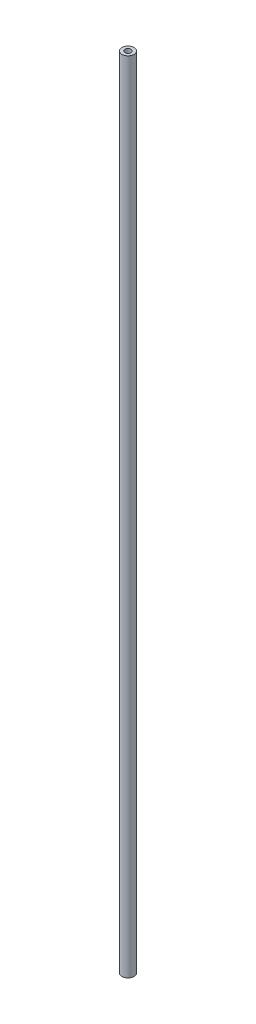
ISO-10303-21;
HEADER;
FILE_DESCRIPTION(('STEP AP214'),'2;1');
FILE_NAME('part.step','',(''),(''),'','','');
FILE_SCHEMA(('AUTOMOTIVE_DESIGN { 1 0 10303 214 1 1 1 1 }'));
ENDSEC;
DATA;
#1=APPLICATION_CONTEXT('core data for automotive mechanical design processes');
#2=APPLICATION_PROTOCOL_DEFINITION('international standard','automotive_design',2000,#1);
#3=PRODUCT_CONTEXT('',#1,'mechanical');
#4=PRODUCT('Part','Part','',(#3));
#5=PRODUCT_RELATED_PRODUCT_CATEGORY('part','',(#4));
#6=PRODUCT_DEFINITION_FORMATION('','',#4);
#7=PRODUCT_DEFINITION_CONTEXT('part definition',#1,'design');
#8=PRODUCT_DEFINITION('design','',#6,#7);
#9=PRODUCT_DEFINITION_SHAPE('','',#8);
#10=(LENGTH_UNIT() NAMED_UNIT(*) SI_UNIT(.MILLI.,.METRE.));
#11=(NAMED_UNIT(*) PLANE_ANGLE_UNIT() SI_UNIT($,.RADIAN.));
#12=(NAMED_UNIT(*) SI_UNIT($,.STERADIAN.) SOLID_ANGLE_UNIT());
#13=UNCERTAINTY_MEASURE_WITH_UNIT(LENGTH_MEASURE(1.E-05),#10,'distance_accuracy_value','');
#14=(GEOMETRIC_REPRESENTATION_CONTEXT(3) GLOBAL_UNCERTAINTY_ASSIGNED_CONTEXT((#13)) GLOBAL_UNIT_ASSIGNED_CONTEXT((#10,
#11,#12)) REPRESENTATION_CONTEXT('',''));
#15=CARTESIAN_POINT('',(0.,0.,0.));
#16=DIRECTION('',(0.,0.,1.));
#17=DIRECTION('',(1.,0.,0.));
#18=AXIS2_PLACEMENT_3D('',#15,#16,#17);
#19=CARTESIAN_POINT('',(0.,841.603219465581,0.));
#20=DIRECTION('',(0.,1.,0.));
#21=DIRECTION('',(0.,0.,1.));
#22=AXIS2_PLACEMENT_3D('',#19,#20,#21);
#23=PLANE('',#22);
#24=CARTESIAN_POINT('',(0.,841.603219465581,0.));
#25=DIRECTION('',(0.,1.,0.));
#26=DIRECTION('',(0.,0.,1.));
#27=AXIS2_PLACEMENT_3D('',#24,#25,#26);
#28=CIRCLE('',#27,6.35);
#29=CARTESIAN_POINT('',(0.,841.603219465581,6.35));
#30=VERTEX_POINT('',#29);
#31=EDGE_CURVE('E10',#30,#30,#28,.T.);
#32=ORIENTED_EDGE('',*,*,#31,.T.);
#33=EDGE_LOOP('',(#32));
#34=FACE_BOUND('',#33,.T.);
#35=CARTESIAN_POINT('',(0.,841.603219465581,0.));
#36=DIRECTION('',(0.,1.,0.));
#37=DIRECTION('',(0.,0.,1.));
#38=AXIS2_PLACEMENT_3D('',#35,#36,#37);
#39=CIRCLE('',#38,3.175);
#40=CARTESIAN_POINT('',(0.,841.603219465581,3.175));
#41=VERTEX_POINT('',#40);
#42=EDGE_CURVE('E59',#41,#41,#39,.T.);
#43=ORIENTED_EDGE('',*,*,#42,.F.);
#44=EDGE_LOOP('',(#43));
#45=FACE_BOUND('',#44,.T.);
#46=ADVANCED_FACE('F44',(#34,#45),#23,.T.);
#47=CARTESIAN_POINT('',(0.,0.,0.));
#48=DIRECTION('',(0.,1.,0.));
#49=DIRECTION('',(0.,0.,1.));
#50=AXIS2_PLACEMENT_3D('',#47,#48,#49);
#51=PLANE('',#50);
#52=CARTESIAN_POINT('',(0.,0.,0.));
#53=DIRECTION('',(0.,1.,0.));
#54=DIRECTION('',(0.,0.,1.));
#55=AXIS2_PLACEMENT_3D('',#52,#53,#54);
#56=CIRCLE('',#55,6.35);
#57=CARTESIAN_POINT('',(0.,0.,6.35));
#58=VERTEX_POINT('',#57);
#59=EDGE_CURVE('E47',#58,#58,#56,.T.);
#60=ORIENTED_EDGE('',*,*,#59,.F.);
#61=EDGE_LOOP('',(#60));
#62=FACE_BOUND('',#61,.T.);
#63=CARTESIAN_POINT('',(0.,0.,0.));
#64=DIRECTION('',(0.,1.,0.));
#65=DIRECTION('',(0.,0.,1.));
#66=AXIS2_PLACEMENT_3D('',#63,#64,#65);
#67=CIRCLE('',#66,3.175);
#68=CARTESIAN_POINT('',(0.,0.,3.175));
#69=VERTEX_POINT('',#68);
#70=EDGE_CURVE('E58',#69,#69,#67,.T.);
#71=ORIENTED_EDGE('',*,*,#70,.T.);
#72=EDGE_LOOP('',(#71));
#73=FACE_BOUND('',#72,.T.);
#74=ADVANCED_FACE('F75',(#62,#73),#51,.F.);
#75=CARTESIAN_POINT('',(0.,841.603219465581,0.));
#76=DIRECTION('',(0.,-1.,0.));
#77=DIRECTION('',(0.,0.,-1.));
#78=AXIS2_PLACEMENT_3D('',#75,#76,#77);
#79=CYLINDRICAL_SURFACE('',#78,6.35);
#80=ORIENTED_EDGE('',*,*,#31,.F.);
#81=EDGE_LOOP('',(#80));
#82=FACE_BOUND('',#81,.T.);
#83=ORIENTED_EDGE('',*,*,#59,.T.);
#84=EDGE_LOOP('',(#83));
#85=FACE_BOUND('',#84,.T.);
#86=ADVANCED_FACE('F50',(#82,#85),#79,.T.);
#87=CARTESIAN_POINT('',(0.,841.603219465581,0.));
#88=DIRECTION('',(0.,-1.,0.));
#89=DIRECTION('',(0.,0.,-1.));
#90=AXIS2_PLACEMENT_3D('',#87,#88,#89);
#91=CYLINDRICAL_SURFACE('',#90,3.175);
#92=ORIENTED_EDGE('',*,*,#42,.T.);
#93=EDGE_LOOP('',(#92));
#94=FACE_BOUND('',#93,.T.);
#95=ORIENTED_EDGE('',*,*,#70,.F.);
#96=EDGE_LOOP('',(#95));
#97=FACE_BOUND('',#96,.T.);
#98=ADVANCED_FACE('F66',(#94,#97),#91,.F.);
#99=CLOSED_SHELL('',(#46,#74,#86,#98));
#100=MANIFOLD_SOLID_BREP('B2',#99);
#101=ADVANCED_BREP_SHAPE_REPRESENTATION('',(#18,#100),#14);
#102=SHAPE_DEFINITION_REPRESENTATION(#9,#101);
ENDSEC;
END-ISO-10303-21;
